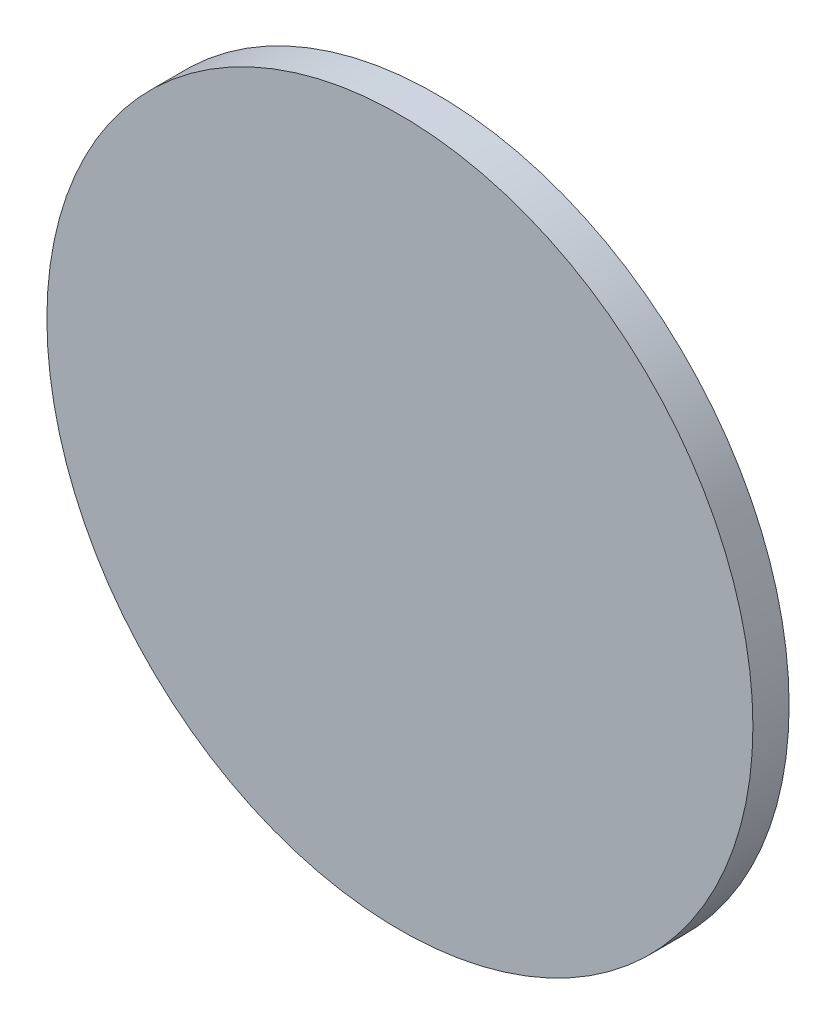
ISO-10303-21;
HEADER;
FILE_DESCRIPTION(('STEP AP214'),'2;1');
FILE_NAME('part.step','',(''),(''),'','','');
FILE_SCHEMA(('AUTOMOTIVE_DESIGN { 1 0 10303 214 1 1 1 1 }'));
ENDSEC;
DATA;
#1=APPLICATION_CONTEXT('core data for automotive mechanical design processes');
#2=APPLICATION_PROTOCOL_DEFINITION('international standard','automotive_design',2000,#1);
#3=PRODUCT_CONTEXT('',#1,'mechanical');
#4=PRODUCT('Part','Part','',(#3));
#5=PRODUCT_RELATED_PRODUCT_CATEGORY('part','',(#4));
#6=PRODUCT_DEFINITION_FORMATION('','',#4);
#7=PRODUCT_DEFINITION_CONTEXT('part definition',#1,'design');
#8=PRODUCT_DEFINITION('design','',#6,#7);
#9=PRODUCT_DEFINITION_SHAPE('','',#8);
#10=(LENGTH_UNIT() NAMED_UNIT(*) SI_UNIT(.MILLI.,.METRE.));
#11=(NAMED_UNIT(*) PLANE_ANGLE_UNIT() SI_UNIT($,.RADIAN.));
#12=(NAMED_UNIT(*) SI_UNIT($,.STERADIAN.) SOLID_ANGLE_UNIT());
#13=UNCERTAINTY_MEASURE_WITH_UNIT(LENGTH_MEASURE(1.E-05),#10,'distance_accuracy_value','');
#14=(GEOMETRIC_REPRESENTATION_CONTEXT(3) GLOBAL_UNCERTAINTY_ASSIGNED_CONTEXT((#13)) GLOBAL_UNIT_ASSIGNED_CONTEXT((#10,
#11,#12)) REPRESENTATION_CONTEXT('',''));
#15=CARTESIAN_POINT('',(0.,0.,0.));
#16=DIRECTION('',(0.,0.,1.));
#17=DIRECTION('',(1.,0.,0.));
#18=AXIS2_PLACEMENT_3D('',#15,#16,#17);
#19=CARTESIAN_POINT('',(0.,0.,2.));
#20=DIRECTION('',(0.,0.,-1.));
#21=DIRECTION('',(-1.,0.,0.));
#22=AXIS2_PLACEMENT_3D('',#19,#20,#21);
#23=CYLINDRICAL_SURFACE('',#22,19.5);
#24=CARTESIAN_POINT('',(0.,0.,2.));
#25=DIRECTION('',(0.,0.,1.));
#26=DIRECTION('',(1.,0.,0.));
#27=AXIS2_PLACEMENT_3D('',#24,#25,#26);
#28=CIRCLE('',#27,19.5);
#29=CARTESIAN_POINT('',(19.5,0.,2.));
#30=VERTEX_POINT('',#29);
#31=EDGE_CURVE('E10',#30,#30,#28,.T.);
#32=ORIENTED_EDGE('',*,*,#31,.F.);
#33=EDGE_LOOP('',(#32));
#34=FACE_BOUND('',#33,.T.);
#35=CARTESIAN_POINT('',(0.,0.,0.));
#36=DIRECTION('',(0.,0.,1.));
#37=DIRECTION('',(1.,0.,0.));
#38=AXIS2_PLACEMENT_3D('',#35,#36,#37);
#39=CIRCLE('',#38,19.5);
#40=CARTESIAN_POINT('',(19.5,0.,0.));
#41=VERTEX_POINT('',#40);
#42=EDGE_CURVE('E40',#41,#41,#39,.T.);
#43=ORIENTED_EDGE('',*,*,#42,.T.);
#44=EDGE_LOOP('',(#43));
#45=FACE_BOUND('',#44,.T.);
#46=ADVANCED_FACE('F37',(#34,#45),#23,.T.);
#47=CARTESIAN_POINT('',(0.,0.,2.));
#48=DIRECTION('',(0.,0.,1.));
#49=DIRECTION('',(1.,0.,0.));
#50=AXIS2_PLACEMENT_3D('',#47,#48,#49);
#51=PLANE('',#50);
#52=ORIENTED_EDGE('',*,*,#31,.T.);
#53=EDGE_LOOP('',(#52));
#54=FACE_BOUND('',#53,.T.);
#55=ADVANCED_FACE('F54',(#54),#51,.T.);
#56=CARTESIAN_POINT('',(0.,0.,0.));
#57=DIRECTION('',(0.,0.,1.));
#58=DIRECTION('',(1.,0.,0.));
#59=AXIS2_PLACEMENT_3D('',#56,#57,#58);
#60=PLANE('',#59);
#61=ORIENTED_EDGE('',*,*,#42,.F.);
#62=EDGE_LOOP('',(#61));
#63=FACE_BOUND('',#62,.T.);
#64=ADVANCED_FACE('F52',(#63),#60,.F.);
#65=CLOSED_SHELL('',(#46,#55,#64));
#66=MANIFOLD_SOLID_BREP('B2',#65);
#67=ADVANCED_BREP_SHAPE_REPRESENTATION('',(#18,#66),#14);
#68=SHAPE_DEFINITION_REPRESENTATION(#9,#67);
ENDSEC;
END-ISO-10303-21;
